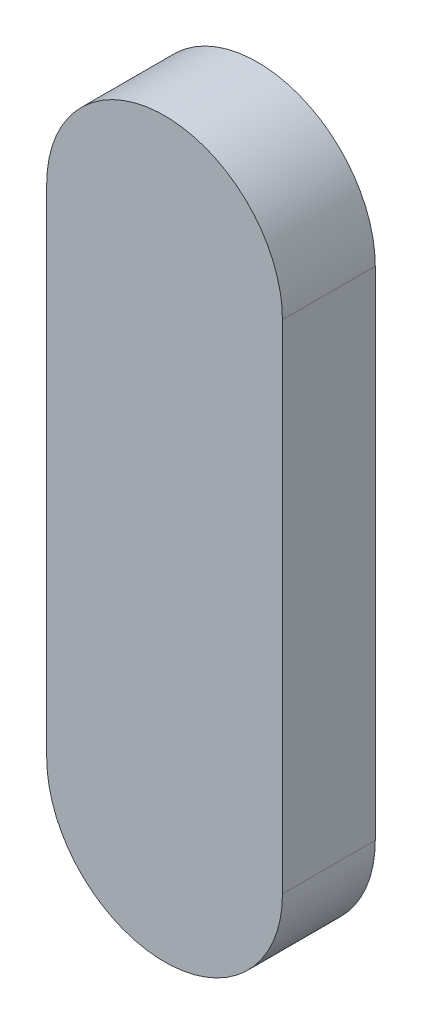
ISO-10303-21;
HEADER;
FILE_DESCRIPTION(('STEP AP214'),'2;1');
FILE_NAME('part.step','',(''),(''),'','','');
FILE_SCHEMA(('AUTOMOTIVE_DESIGN { 1 0 10303 214 1 1 1 1 }'));
ENDSEC;
DATA;
#1=APPLICATION_CONTEXT('core data for automotive mechanical design processes');
#2=APPLICATION_PROTOCOL_DEFINITION('international standard','automotive_design',2000,#1);
#3=PRODUCT_CONTEXT('',#1,'mechanical');
#4=PRODUCT('Part','Part','',(#3));
#5=PRODUCT_RELATED_PRODUCT_CATEGORY('part','',(#4));
#6=PRODUCT_DEFINITION_FORMATION('','',#4);
#7=PRODUCT_DEFINITION_CONTEXT('part definition',#1,'design');
#8=PRODUCT_DEFINITION('design','',#6,#7);
#9=PRODUCT_DEFINITION_SHAPE('','',#8);
#10=(LENGTH_UNIT() NAMED_UNIT(*) SI_UNIT(.MILLI.,.METRE.));
#11=(NAMED_UNIT(*) PLANE_ANGLE_UNIT() SI_UNIT($,.RADIAN.));
#12=(NAMED_UNIT(*) SI_UNIT($,.STERADIAN.) SOLID_ANGLE_UNIT());
#13=UNCERTAINTY_MEASURE_WITH_UNIT(LENGTH_MEASURE(1.E-05),#10,'distance_accuracy_value','');
#14=(GEOMETRIC_REPRESENTATION_CONTEXT(3) GLOBAL_UNCERTAINTY_ASSIGNED_CONTEXT((#13)) GLOBAL_UNIT_ASSIGNED_CONTEXT((#10,
#11,#12)) REPRESENTATION_CONTEXT('',''));
#15=CARTESIAN_POINT('',(0.,0.,0.));
#16=DIRECTION('',(0.,0.,1.));
#17=DIRECTION('',(1.,0.,0.));
#18=AXIS2_PLACEMENT_3D('',#15,#16,#17);
#19=CARTESIAN_POINT('',(151.498808,84.340192,0.));
#20=DIRECTION('',(-1.,0.,0.));
#21=DIRECTION('',(0.,1.,0.));
#22=AXIS2_PLACEMENT_3D('',#19,#20,#21);
#23=PLANE('',#22);
#24=DIRECTION('',(0.,1.,0.));
#25=VECTOR('',#24,1.);
#26=CARTESIAN_POINT('',(151.498808,84.340192,0.1999996));
#27=LINE('',#26,#25);
#28=CARTESIAN_POINT('',(151.498808,84.340192,0.1999996));
#29=VERTEX_POINT('',#28);
#30=CARTESIAN_POINT('',(151.498808,85.4115132,0.1999996));
#31=VERTEX_POINT('',#30);
#32=EDGE_CURVE('E11',#29,#31,#27,.T.);
#33=ORIENTED_EDGE('',*,*,#32,.F.);
#34=DIRECTION('',(0.,0.,1.));
#35=VECTOR('',#34,1.);
#36=CARTESIAN_POINT('',(151.498808,84.340192,0.));
#37=LINE('',#36,#35);
#38=CARTESIAN_POINT('',(151.498808,84.340192,0.));
#39=VERTEX_POINT('',#38);
#40=EDGE_CURVE('E24',#39,#29,#37,.T.);
#41=ORIENTED_EDGE('',*,*,#40,.F.);
#42=DIRECTION('',(0.,1.,0.));
#43=VECTOR('',#42,1.);
#44=CARTESIAN_POINT('',(151.498808,84.340192,0.));
#45=LINE('',#44,#43);
#46=CARTESIAN_POINT('',(151.498808,85.4115132,0.));
#47=VERTEX_POINT('',#46);
#48=EDGE_CURVE('E75',#39,#47,#45,.T.);
#49=ORIENTED_EDGE('',*,*,#48,.T.);
#50=DIRECTION('',(0.,0.,1.));
#51=VECTOR('',#50,1.);
#52=CARTESIAN_POINT('',(151.498808,85.4115132,0.));
#53=LINE('',#52,#51);
#54=EDGE_CURVE('E37',#47,#31,#53,.T.);
#55=ORIENTED_EDGE('',*,*,#54,.T.);
#56=EDGE_LOOP('',(#33,#41,#49,#55));
#57=FACE_BOUND('',#56,.T.);
#58=ADVANCED_FACE('F17',(#57),#23,.F.);
#59=CARTESIAN_POINT('',(151.244808,85.4115132,0.));
#60=DIRECTION('',(0.,0.,-1.));
#61=DIRECTION('',(1.,1.1189649382048E-13,0.));
#62=AXIS2_PLACEMENT_3D('',#59,#60,#61);
#63=CYLINDRICAL_SURFACE('',#62,0.25400000000001);
#64=CARTESIAN_POINT('',(151.244808,85.4115132,0.1999996));
#65=DIRECTION('',(0.,0.,1.));
#66=DIRECTION('',(1.,1.1189649382048E-13,0.));
#67=AXIS2_PLACEMENT_3D('',#64,#65,#66);
#68=CIRCLE('',#67,0.25400000000001);
#69=CARTESIAN_POINT('',(150.990808,85.4115132,0.1999996));
#70=VERTEX_POINT('',#69);
#71=EDGE_CURVE('E83',#31,#70,#68,.T.);
#72=ORIENTED_EDGE('',*,*,#71,.F.);
#73=ORIENTED_EDGE('',*,*,#54,.F.);
#74=CARTESIAN_POINT('',(151.244808,85.4115132,0.));
#75=DIRECTION('',(0.,0.,1.));
#76=DIRECTION('',(1.,1.1189649382048E-13,0.));
#77=AXIS2_PLACEMENT_3D('',#74,#75,#76);
#78=CIRCLE('',#77,0.25400000000001);
#79=CARTESIAN_POINT('',(150.990808,85.4115132,0.));
#80=VERTEX_POINT('',#79);
#81=EDGE_CURVE('E81',#47,#80,#78,.T.);
#82=ORIENTED_EDGE('',*,*,#81,.T.);
#83=DIRECTION('',(0.,0.,1.));
#84=VECTOR('',#83,1.);
#85=CARTESIAN_POINT('',(150.990808,85.4115132,0.));
#86=LINE('',#85,#84);
#87=EDGE_CURVE('E67',#80,#70,#86,.T.);
#88=ORIENTED_EDGE('',*,*,#87,.T.);
#89=EDGE_LOOP('',(#72,#73,#82,#88));
#90=FACE_BOUND('',#89,.T.);
#91=ADVANCED_FACE('F89',(#90),#63,.T.);
#92=CARTESIAN_POINT('',(150.990808,85.4115132,0.));
#93=DIRECTION('',(1.,0.,0.));
#94=DIRECTION('',(0.,-1.,0.));
#95=AXIS2_PLACEMENT_3D('',#92,#93,#94);
#96=PLANE('',#95);
#97=DIRECTION('',(0.,-1.,0.));
#98=VECTOR('',#97,1.);
#99=CARTESIAN_POINT('',(150.990808,85.4115132,0.1999996));
#100=LINE('',#99,#98);
#101=CARTESIAN_POINT('',(150.990808,84.340192,0.1999996));
#102=VERTEX_POINT('',#101);
#103=EDGE_CURVE('E71',#70,#102,#100,.T.);
#104=ORIENTED_EDGE('',*,*,#103,.F.);
#105=ORIENTED_EDGE('',*,*,#87,.F.);
#106=DIRECTION('',(0.,-1.,0.));
#107=VECTOR('',#106,1.);
#108=CARTESIAN_POINT('',(150.990808,85.4115132,0.));
#109=LINE('',#108,#107);
#110=CARTESIAN_POINT('',(150.990808,84.340192,0.));
#111=VERTEX_POINT('',#110);
#112=EDGE_CURVE('E63',#80,#111,#109,.T.);
#113=ORIENTED_EDGE('',*,*,#112,.T.);
#114=DIRECTION('',(0.,0.,1.));
#115=VECTOR('',#114,1.);
#116=CARTESIAN_POINT('',(150.990808,84.340192,0.));
#117=LINE('',#116,#115);
#118=EDGE_CURVE('E53',#111,#102,#117,.T.);
#119=ORIENTED_EDGE('',*,*,#118,.T.);
#120=EDGE_LOOP('',(#104,#105,#113,#119));
#121=FACE_BOUND('',#120,.T.);
#122=ADVANCED_FACE('F66',(#121),#96,.F.);
#123=CARTESIAN_POINT('',(151.244808,84.340192,0.));
#124=DIRECTION('',(0.,0.,-1.));
#125=DIRECTION('',(-1.,0.,0.));
#126=AXIS2_PLACEMENT_3D('',#123,#124,#125);
#127=CYLINDRICAL_SURFACE('',#126,0.254000000000005);
#128=CARTESIAN_POINT('',(151.244808,84.340192,0.1999996));
#129=DIRECTION('',(0.,0.,1.));
#130=DIRECTION('',(-1.,0.,0.));
#131=AXIS2_PLACEMENT_3D('',#128,#129,#130);
#132=CIRCLE('',#131,0.254000000000005);
#133=EDGE_CURVE('E59',#102,#29,#132,.T.);
#134=ORIENTED_EDGE('',*,*,#133,.F.);
#135=ORIENTED_EDGE('',*,*,#118,.F.);
#136=CARTESIAN_POINT('',(151.244808,84.340192,0.));
#137=DIRECTION('',(0.,0.,1.));
#138=DIRECTION('',(-1.,0.,0.));
#139=AXIS2_PLACEMENT_3D('',#136,#137,#138);
#140=CIRCLE('',#139,0.254000000000005);
#141=EDGE_CURVE('E57',#111,#39,#140,.T.);
#142=ORIENTED_EDGE('',*,*,#141,.T.);
#143=ORIENTED_EDGE('',*,*,#40,.T.);
#144=EDGE_LOOP('',(#134,#135,#142,#143));
#145=FACE_BOUND('',#144,.T.);
#146=ADVANCED_FACE('F55',(#145),#127,.T.);
#147=CARTESIAN_POINT('',(151.498808,84.340192,0.));
#148=DIRECTION('',(0.,0.,-1.));
#149=DIRECTION('',(-1.,0.,0.));
#150=AXIS2_PLACEMENT_3D('',#147,#148,#149);
#151=PLANE('',#150);
#152=ORIENTED_EDGE('',*,*,#141,.F.);
#153=ORIENTED_EDGE('',*,*,#112,.F.);
#154=ORIENTED_EDGE('',*,*,#81,.F.);
#155=ORIENTED_EDGE('',*,*,#48,.F.);
#156=EDGE_LOOP('',(#152,#153,#154,#155));
#157=FACE_BOUND('',#156,.T.);
#158=ADVANCED_FACE('F74',(#157),#151,.T.);
#159=CARTESIAN_POINT('',(151.498808,84.340192,0.1999996));
#160=DIRECTION('',(0.,0.,-1.));
#161=DIRECTION('',(-1.,0.,0.));
#162=AXIS2_PLACEMENT_3D('',#159,#160,#161);
#163=PLANE('',#162);
#164=ORIENTED_EDGE('',*,*,#32,.T.);
#165=ORIENTED_EDGE('',*,*,#71,.T.);
#166=ORIENTED_EDGE('',*,*,#103,.T.);
#167=ORIENTED_EDGE('',*,*,#133,.T.);
#168=EDGE_LOOP('',(#164,#165,#166,#167));
#169=FACE_BOUND('',#168,.T.);
#170=ADVANCED_FACE('F91',(#169),#163,.F.);
#171=CLOSED_SHELL('',(#58,#91,#122,#146,#158,#170));
#172=MANIFOLD_SOLID_BREP('B1',#171);
#173=ADVANCED_BREP_SHAPE_REPRESENTATION('',(#18,#172),#14);
#174=SHAPE_DEFINITION_REPRESENTATION(#9,#173);
ENDSEC;
END-ISO-10303-21;
